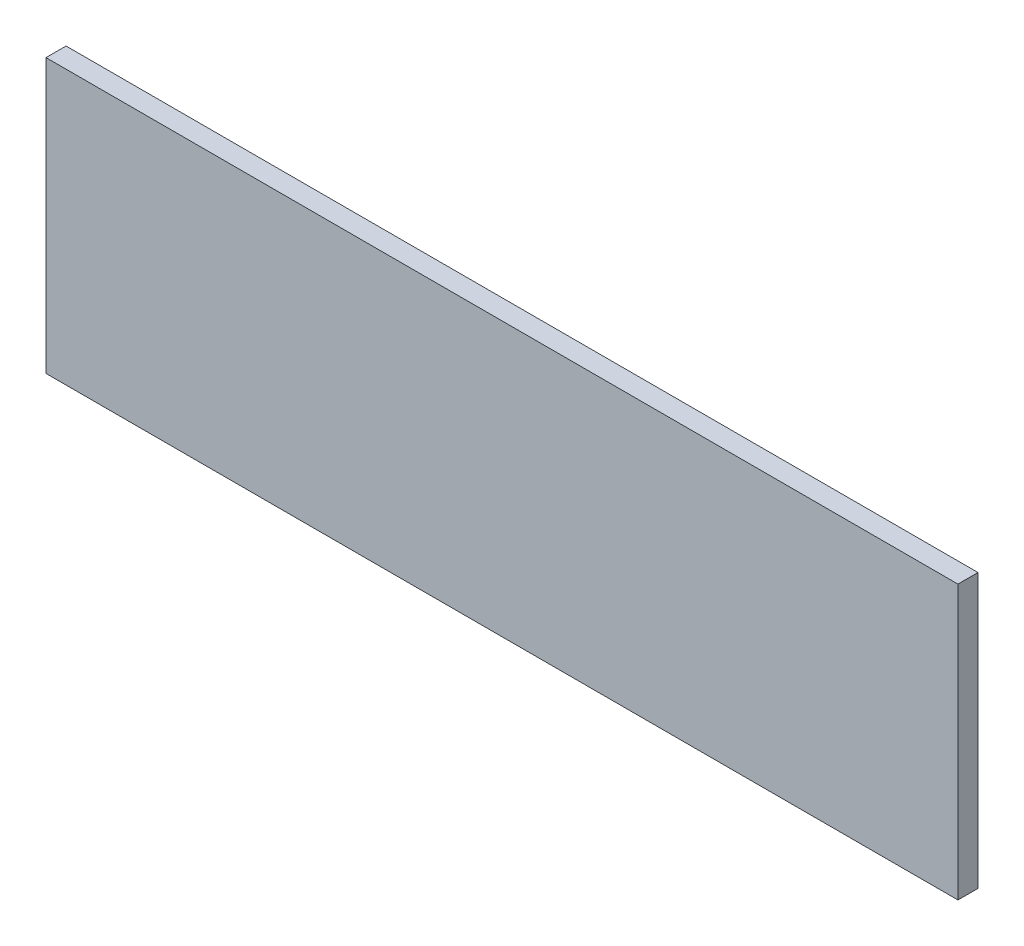
ISO-10303-21;
HEADER;
FILE_DESCRIPTION(('STEP AP214'),'2;1');
FILE_NAME('part.step','',(''),(''),'','','');
FILE_SCHEMA(('AUTOMOTIVE_DESIGN { 1 0 10303 214 1 1 1 1 }'));
ENDSEC;
DATA;
#1=APPLICATION_CONTEXT('core data for automotive mechanical design processes');
#2=APPLICATION_PROTOCOL_DEFINITION('international standard','automotive_design',2000,#1);
#3=PRODUCT_CONTEXT('',#1,'mechanical');
#4=PRODUCT('Part','Part','',(#3));
#5=PRODUCT_RELATED_PRODUCT_CATEGORY('part','',(#4));
#6=PRODUCT_DEFINITION_FORMATION('','',#4);
#7=PRODUCT_DEFINITION_CONTEXT('part definition',#1,'design');
#8=PRODUCT_DEFINITION('design','',#6,#7);
#9=PRODUCT_DEFINITION_SHAPE('','',#8);
#10=(LENGTH_UNIT() NAMED_UNIT(*) SI_UNIT(.MILLI.,.METRE.));
#11=(NAMED_UNIT(*) PLANE_ANGLE_UNIT() SI_UNIT($,.RADIAN.));
#12=(NAMED_UNIT(*) SI_UNIT($,.STERADIAN.) SOLID_ANGLE_UNIT());
#13=UNCERTAINTY_MEASURE_WITH_UNIT(LENGTH_MEASURE(1.E-05),#10,'distance_accuracy_value','');
#14=(GEOMETRIC_REPRESENTATION_CONTEXT(3) GLOBAL_UNCERTAINTY_ASSIGNED_CONTEXT((#13)) GLOBAL_UNIT_ASSIGNED_CONTEXT((#10,
#11,#12)) REPRESENTATION_CONTEXT('',''));
#15=CARTESIAN_POINT('',(0.,0.,0.));
#16=DIRECTION('',(0.,0.,1.));
#17=DIRECTION('',(1.,0.,0.));
#18=AXIS2_PLACEMENT_3D('',#15,#16,#17);
#19=CARTESIAN_POINT('',(127.,-38.1,5.588));
#20=DIRECTION('',(-1.,0.,0.));
#21=DIRECTION('',(0.,0.,1.));
#22=AXIS2_PLACEMENT_3D('',#19,#20,#21);
#23=PLANE('',#22);
#24=DIRECTION('',(0.,1.,0.));
#25=VECTOR('',#24,1.);
#26=CARTESIAN_POINT('',(127.,-38.1,0.));
#27=LINE('',#26,#25);
#28=CARTESIAN_POINT('',(127.,-38.1,0.));
#29=VERTEX_POINT('',#28);
#30=CARTESIAN_POINT('',(127.,38.1,0.));
#31=VERTEX_POINT('',#30);
#32=EDGE_CURVE('E98',#29,#31,#27,.T.);
#33=ORIENTED_EDGE('',*,*,#32,.T.);
#34=DIRECTION('',(0.,0.,-1.));
#35=VECTOR('',#34,1.);
#36=CARTESIAN_POINT('',(127.,38.1,5.588));
#37=LINE('',#36,#35);
#38=CARTESIAN_POINT('',(127.,38.1,5.588));
#39=VERTEX_POINT('',#38);
#40=EDGE_CURVE('E11',#39,#31,#37,.T.);
#41=ORIENTED_EDGE('',*,*,#40,.F.);
#42=DIRECTION('',(0.,1.,0.));
#43=VECTOR('',#42,1.);
#44=CARTESIAN_POINT('',(127.,-38.1,5.588));
#45=LINE('',#44,#43);
#46=CARTESIAN_POINT('',(127.,-38.1,5.588));
#47=VERTEX_POINT('',#46);
#48=EDGE_CURVE('E86',#47,#39,#45,.T.);
#49=ORIENTED_EDGE('',*,*,#48,.F.);
#50=DIRECTION('',(0.,0.,-1.));
#51=VECTOR('',#50,1.);
#52=CARTESIAN_POINT('',(127.,-38.1,5.588));
#53=LINE('',#52,#51);
#54=EDGE_CURVE('E94',#47,#29,#53,.T.);
#55=ORIENTED_EDGE('',*,*,#54,.T.);
#56=EDGE_LOOP('',(#33,#41,#49,#55));
#57=FACE_BOUND('',#56,.T.);
#58=ADVANCED_FACE('F35',(#57),#23,.F.);
#59=CARTESIAN_POINT('',(-127.,38.1,5.588));
#60=DIRECTION('',(0.,-1.,0.));
#61=DIRECTION('',(0.,0.,-1.));
#62=AXIS2_PLACEMENT_3D('',#59,#60,#61);
#63=PLANE('',#62);
#64=DIRECTION('',(-1.,0.,0.));
#65=VECTOR('',#64,1.);
#66=CARTESIAN_POINT('',(-127.,38.1,0.));
#67=LINE('',#66,#65);
#68=CARTESIAN_POINT('',(-127.,38.1,0.));
#69=VERTEX_POINT('',#68);
#70=EDGE_CURVE('E90',#31,#69,#67,.T.);
#71=ORIENTED_EDGE('',*,*,#70,.T.);
#72=DIRECTION('',(0.,0.,-1.));
#73=VECTOR('',#72,1.);
#74=CARTESIAN_POINT('',(-127.,38.1,5.588));
#75=LINE('',#74,#73);
#76=CARTESIAN_POINT('',(-127.,38.1,5.588));
#77=VERTEX_POINT('',#76);
#78=EDGE_CURVE('E43',#77,#69,#75,.T.);
#79=ORIENTED_EDGE('',*,*,#78,.F.);
#80=DIRECTION('',(-1.,0.,0.));
#81=VECTOR('',#80,1.);
#82=CARTESIAN_POINT('',(-127.,38.1,5.588));
#83=LINE('',#82,#81);
#84=EDGE_CURVE('E81',#39,#77,#83,.T.);
#85=ORIENTED_EDGE('',*,*,#84,.F.);
#86=ORIENTED_EDGE('',*,*,#40,.T.);
#87=EDGE_LOOP('',(#71,#79,#85,#86));
#88=FACE_BOUND('',#87,.T.);
#89=ADVANCED_FACE('F89',(#88),#63,.F.);
#90=CARTESIAN_POINT('',(-127.,-38.1,5.588));
#91=DIRECTION('',(1.,0.,0.));
#92=DIRECTION('',(0.,0.,-1.));
#93=AXIS2_PLACEMENT_3D('',#90,#91,#92);
#94=PLANE('',#93);
#95=DIRECTION('',(0.,-1.,0.));
#96=VECTOR('',#95,1.);
#97=CARTESIAN_POINT('',(-127.,-38.1,0.));
#98=LINE('',#97,#96);
#99=CARTESIAN_POINT('',(-127.,-38.1,0.));
#100=VERTEX_POINT('',#99);
#101=EDGE_CURVE('E68',#69,#100,#98,.T.);
#102=ORIENTED_EDGE('',*,*,#101,.T.);
#103=DIRECTION('',(0.,0.,-1.));
#104=VECTOR('',#103,1.);
#105=CARTESIAN_POINT('',(-127.,-38.1,5.588));
#106=LINE('',#105,#104);
#107=CARTESIAN_POINT('',(-127.,-38.1,5.588));
#108=VERTEX_POINT('',#107);
#109=EDGE_CURVE('E91',#108,#100,#106,.T.);
#110=ORIENTED_EDGE('',*,*,#109,.F.);
#111=DIRECTION('',(0.,-1.,0.));
#112=VECTOR('',#111,1.);
#113=CARTESIAN_POINT('',(-127.,-38.1,5.588));
#114=LINE('',#113,#112);
#115=EDGE_CURVE('E84',#77,#108,#114,.T.);
#116=ORIENTED_EDGE('',*,*,#115,.F.);
#117=ORIENTED_EDGE('',*,*,#78,.T.);
#118=EDGE_LOOP('',(#102,#110,#116,#117));
#119=FACE_BOUND('',#118,.T.);
#120=ADVANCED_FACE('F92',(#119),#94,.F.);
#121=CARTESIAN_POINT('',(-127.,-38.1,5.588));
#122=DIRECTION('',(0.,1.,0.));
#123=DIRECTION('',(0.,0.,1.));
#124=AXIS2_PLACEMENT_3D('',#121,#122,#123);
#125=PLANE('',#124);
#126=DIRECTION('',(1.,0.,0.));
#127=VECTOR('',#126,1.);
#128=CARTESIAN_POINT('',(-127.,-38.1,0.));
#129=LINE('',#128,#127);
#130=EDGE_CURVE('E74',#100,#29,#129,.T.);
#131=ORIENTED_EDGE('',*,*,#130,.T.);
#132=ORIENTED_EDGE('',*,*,#54,.F.);
#133=DIRECTION('',(1.,0.,0.));
#134=VECTOR('',#133,1.);
#135=CARTESIAN_POINT('',(-127.,-38.1,5.588));
#136=LINE('',#135,#134);
#137=EDGE_CURVE('E51',#108,#47,#136,.T.);
#138=ORIENTED_EDGE('',*,*,#137,.F.);
#139=ORIENTED_EDGE('',*,*,#109,.T.);
#140=EDGE_LOOP('',(#131,#132,#138,#139));
#141=FACE_BOUND('',#140,.T.);
#142=ADVANCED_FACE('F105',(#141),#125,.F.);
#143=CARTESIAN_POINT('',(0.,0.,5.588));
#144=DIRECTION('',(0.,0.,-1.));
#145=DIRECTION('',(-1.,0.,0.));
#146=AXIS2_PLACEMENT_3D('',#143,#144,#145);
#147=PLANE('',#146);
#148=ORIENTED_EDGE('',*,*,#48,.T.);
#149=ORIENTED_EDGE('',*,*,#84,.T.);
#150=ORIENTED_EDGE('',*,*,#115,.T.);
#151=ORIENTED_EDGE('',*,*,#137,.T.);
#152=EDGE_LOOP('',(#148,#149,#150,#151));
#153=FACE_BOUND('',#152,.T.);
#154=ADVANCED_FACE('F82',(#153),#147,.F.);
#155=CARTESIAN_POINT('',(0.,0.,0.));
#156=DIRECTION('',(0.,0.,-1.));
#157=DIRECTION('',(-1.,0.,0.));
#158=AXIS2_PLACEMENT_3D('',#155,#156,#157);
#159=PLANE('',#158);
#160=ORIENTED_EDGE('',*,*,#32,.F.);
#161=ORIENTED_EDGE('',*,*,#130,.F.);
#162=ORIENTED_EDGE('',*,*,#101,.F.);
#163=ORIENTED_EDGE('',*,*,#70,.F.);
#164=EDGE_LOOP('',(#160,#161,#162,#163));
#165=FACE_BOUND('',#164,.T.);
#166=ADVANCED_FACE('F108',(#165),#159,.T.);
#167=CLOSED_SHELL('',(#58,#89,#120,#142,#154,#166));
#168=MANIFOLD_SOLID_BREP('B2',#167);
#169=ADVANCED_BREP_SHAPE_REPRESENTATION('',(#18,#168),#14);
#170=SHAPE_DEFINITION_REPRESENTATION(#9,#169);
ENDSEC;
END-ISO-10303-21;
